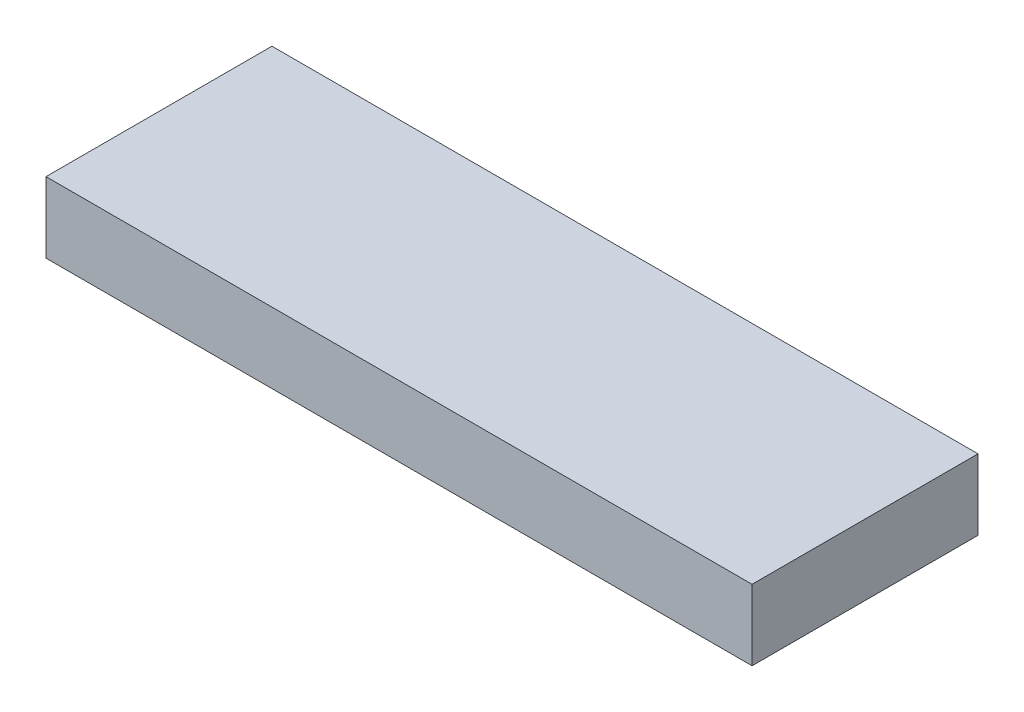
ISO-10303-21;
HEADER;
FILE_DESCRIPTION(('STEP AP214'),'2;1');
FILE_NAME('part.step','',(''),(''),'','','');
FILE_SCHEMA(('AUTOMOTIVE_DESIGN { 1 0 10303 214 1 1 1 1 }'));
ENDSEC;
DATA;
#1=APPLICATION_CONTEXT('core data for automotive mechanical design processes');
#2=APPLICATION_PROTOCOL_DEFINITION('international standard','automotive_design',2000,#1);
#3=PRODUCT_CONTEXT('',#1,'mechanical');
#4=PRODUCT('Part','Part','',(#3));
#5=PRODUCT_RELATED_PRODUCT_CATEGORY('part','',(#4));
#6=PRODUCT_DEFINITION_FORMATION('','',#4);
#7=PRODUCT_DEFINITION_CONTEXT('part definition',#1,'design');
#8=PRODUCT_DEFINITION('design','',#6,#7);
#9=PRODUCT_DEFINITION_SHAPE('','',#8);
#10=(LENGTH_UNIT() NAMED_UNIT(*) SI_UNIT(.MILLI.,.METRE.));
#11=(NAMED_UNIT(*) PLANE_ANGLE_UNIT() SI_UNIT($,.RADIAN.));
#12=(NAMED_UNIT(*) SI_UNIT($,.STERADIAN.) SOLID_ANGLE_UNIT());
#13=UNCERTAINTY_MEASURE_WITH_UNIT(LENGTH_MEASURE(1.E-05),#10,'distance_accuracy_value','');
#14=(GEOMETRIC_REPRESENTATION_CONTEXT(3) GLOBAL_UNCERTAINTY_ASSIGNED_CONTEXT((#13)) GLOBAL_UNIT_ASSIGNED_CONTEXT((#10,
#11,#12)) REPRESENTATION_CONTEXT('',''));
#15=CARTESIAN_POINT('',(0.,0.,0.));
#16=DIRECTION('',(0.,0.,1.));
#17=DIRECTION('',(1.,0.,0.));
#18=AXIS2_PLACEMENT_3D('',#15,#16,#17);
#19=CARTESIAN_POINT('',(0.,2.5,0.));
#20=DIRECTION('',(1.,0.,0.));
#21=DIRECTION('',(0.,0.,-1.));
#22=AXIS2_PLACEMENT_3D('',#19,#20,#21);
#23=PLANE('',#22);
#24=DIRECTION('',(0.,0.,1.));
#25=VECTOR('',#24,1.);
#26=CARTESIAN_POINT('',(0.,0.,0.));
#27=LINE('',#26,#25);
#28=CARTESIAN_POINT('',(0.,0.,-8.));
#29=VERTEX_POINT('',#28);
#30=CARTESIAN_POINT('',(0.,0.,0.));
#31=VERTEX_POINT('',#30);
#32=EDGE_CURVE('E107',#29,#31,#27,.T.);
#33=ORIENTED_EDGE('',*,*,#32,.T.);
#34=DIRECTION('',(0.,-1.,0.));
#35=VECTOR('',#34,1.);
#36=CARTESIAN_POINT('',(0.,2.5,0.));
#37=LINE('',#36,#35);
#38=CARTESIAN_POINT('',(0.,2.5,0.));
#39=VERTEX_POINT('',#38);
#40=EDGE_CURVE('E11',#39,#31,#37,.T.);
#41=ORIENTED_EDGE('',*,*,#40,.F.);
#42=DIRECTION('',(0.,0.,1.));
#43=VECTOR('',#42,1.);
#44=CARTESIAN_POINT('',(0.,2.5,0.));
#45=LINE('',#44,#43);
#46=CARTESIAN_POINT('',(0.,2.5,-8.));
#47=VERTEX_POINT('',#46);
#48=EDGE_CURVE('E91',#47,#39,#45,.T.);
#49=ORIENTED_EDGE('',*,*,#48,.F.);
#50=DIRECTION('',(0.,-1.,0.));
#51=VECTOR('',#50,1.);
#52=CARTESIAN_POINT('',(0.,2.5,-8.));
#53=LINE('',#52,#51);
#54=EDGE_CURVE('E103',#47,#29,#53,.T.);
#55=ORIENTED_EDGE('',*,*,#54,.T.);
#56=EDGE_LOOP('',(#33,#41,#49,#55));
#57=FACE_BOUND('',#56,.T.);
#58=ADVANCED_FACE('F39',(#57),#23,.F.);
#59=CARTESIAN_POINT('',(0.,2.5,0.));
#60=DIRECTION('',(0.,0.,-1.));
#61=DIRECTION('',(-1.,0.,0.));
#62=AXIS2_PLACEMENT_3D('',#59,#60,#61);
#63=PLANE('',#62);
#64=DIRECTION('',(1.,0.,0.));
#65=VECTOR('',#64,1.);
#66=CARTESIAN_POINT('',(0.,0.,0.));
#67=LINE('',#66,#65);
#68=CARTESIAN_POINT('',(25.,0.,0.));
#69=VERTEX_POINT('',#68);
#70=EDGE_CURVE('E96',#31,#69,#67,.T.);
#71=ORIENTED_EDGE('',*,*,#70,.T.);
#72=DIRECTION('',(0.,-1.,0.));
#73=VECTOR('',#72,1.);
#74=CARTESIAN_POINT('',(25.,2.5,0.));
#75=LINE('',#74,#73);
#76=CARTESIAN_POINT('',(25.,2.5,0.));
#77=VERTEX_POINT('',#76);
#78=EDGE_CURVE('E48',#77,#69,#75,.T.);
#79=ORIENTED_EDGE('',*,*,#78,.F.);
#80=DIRECTION('',(1.,0.,0.));
#81=VECTOR('',#80,1.);
#82=CARTESIAN_POINT('',(0.,2.5,0.));
#83=LINE('',#82,#81);
#84=EDGE_CURVE('E86',#39,#77,#83,.T.);
#85=ORIENTED_EDGE('',*,*,#84,.F.);
#86=ORIENTED_EDGE('',*,*,#40,.T.);
#87=EDGE_LOOP('',(#71,#79,#85,#86));
#88=FACE_BOUND('',#87,.T.);
#89=ADVANCED_FACE('F95',(#88),#63,.F.);
#90=CARTESIAN_POINT('',(25.,2.5,0.));
#91=DIRECTION('',(-1.,0.,0.));
#92=DIRECTION('',(0.,0.,1.));
#93=AXIS2_PLACEMENT_3D('',#90,#91,#92);
#94=PLANE('',#93);
#95=DIRECTION('',(0.,0.,-1.));
#96=VECTOR('',#95,1.);
#97=CARTESIAN_POINT('',(25.,0.,0.));
#98=LINE('',#97,#96);
#99=CARTESIAN_POINT('',(25.,0.,-8.));
#100=VERTEX_POINT('',#99);
#101=EDGE_CURVE('E73',#69,#100,#98,.T.);
#102=ORIENTED_EDGE('',*,*,#101,.T.);
#103=DIRECTION('',(0.,-1.,0.));
#104=VECTOR('',#103,1.);
#105=CARTESIAN_POINT('',(25.,2.5,-8.));
#106=LINE('',#105,#104);
#107=CARTESIAN_POINT('',(25.,2.5,-8.));
#108=VERTEX_POINT('',#107);
#109=EDGE_CURVE('E98',#108,#100,#106,.T.);
#110=ORIENTED_EDGE('',*,*,#109,.F.);
#111=DIRECTION('',(0.,0.,-1.));
#112=VECTOR('',#111,1.);
#113=CARTESIAN_POINT('',(25.,2.5,0.));
#114=LINE('',#113,#112);
#115=EDGE_CURVE('E89',#77,#108,#114,.T.);
#116=ORIENTED_EDGE('',*,*,#115,.F.);
#117=ORIENTED_EDGE('',*,*,#78,.T.);
#118=EDGE_LOOP('',(#102,#110,#116,#117));
#119=FACE_BOUND('',#118,.T.);
#120=ADVANCED_FACE('F99',(#119),#94,.F.);
#121=CARTESIAN_POINT('',(0.,2.5,-8.));
#122=DIRECTION('',(0.,0.,1.));
#123=DIRECTION('',(1.,0.,0.));
#124=AXIS2_PLACEMENT_3D('',#121,#122,#123);
#125=PLANE('',#124);
#126=DIRECTION('',(-1.,0.,0.));
#127=VECTOR('',#126,1.);
#128=CARTESIAN_POINT('',(0.,0.,-8.));
#129=LINE('',#128,#127);
#130=EDGE_CURVE('E79',#100,#29,#129,.T.);
#131=ORIENTED_EDGE('',*,*,#130,.T.);
#132=ORIENTED_EDGE('',*,*,#54,.F.);
#133=DIRECTION('',(-1.,0.,0.));
#134=VECTOR('',#133,1.);
#135=CARTESIAN_POINT('',(0.,2.5,-8.));
#136=LINE('',#135,#134);
#137=EDGE_CURVE('E56',#108,#47,#136,.T.);
#138=ORIENTED_EDGE('',*,*,#137,.F.);
#139=ORIENTED_EDGE('',*,*,#109,.T.);
#140=EDGE_LOOP('',(#131,#132,#138,#139));
#141=FACE_BOUND('',#140,.T.);
#142=ADVANCED_FACE('F120',(#141),#125,.F.);
#143=CARTESIAN_POINT('',(0.,2.5,0.));
#144=DIRECTION('',(0.,-1.,0.));
#145=DIRECTION('',(0.,0.,-1.));
#146=AXIS2_PLACEMENT_3D('',#143,#144,#145);
#147=PLANE('',#146);
#148=ORIENTED_EDGE('',*,*,#48,.T.);
#149=ORIENTED_EDGE('',*,*,#84,.T.);
#150=ORIENTED_EDGE('',*,*,#115,.T.);
#151=ORIENTED_EDGE('',*,*,#137,.T.);
#152=EDGE_LOOP('',(#148,#149,#150,#151));
#153=FACE_BOUND('',#152,.T.);
#154=ADVANCED_FACE('F87',(#153),#147,.F.);
#155=CARTESIAN_POINT('',(0.,0.,0.));
#156=DIRECTION('',(0.,-1.,0.));
#157=DIRECTION('',(0.,0.,-1.));
#158=AXIS2_PLACEMENT_3D('',#155,#156,#157);
#159=PLANE('',#158);
#160=ORIENTED_EDGE('',*,*,#32,.F.);
#161=ORIENTED_EDGE('',*,*,#130,.F.);
#162=ORIENTED_EDGE('',*,*,#101,.F.);
#163=ORIENTED_EDGE('',*,*,#70,.F.);
#164=EDGE_LOOP('',(#160,#161,#162,#163));
#165=FACE_BOUND('',#164,.T.);
#166=ADVANCED_FACE('F123',(#165),#159,.T.);
#167=CLOSED_SHELL('',(#58,#89,#120,#142,#154,#166));
#168=MANIFOLD_SOLID_BREP('B2',#167);
#169=ADVANCED_BREP_SHAPE_REPRESENTATION('',(#18,#168),#14);
#170=SHAPE_DEFINITION_REPRESENTATION(#9,#169);
ENDSEC;
END-ISO-10303-21;
